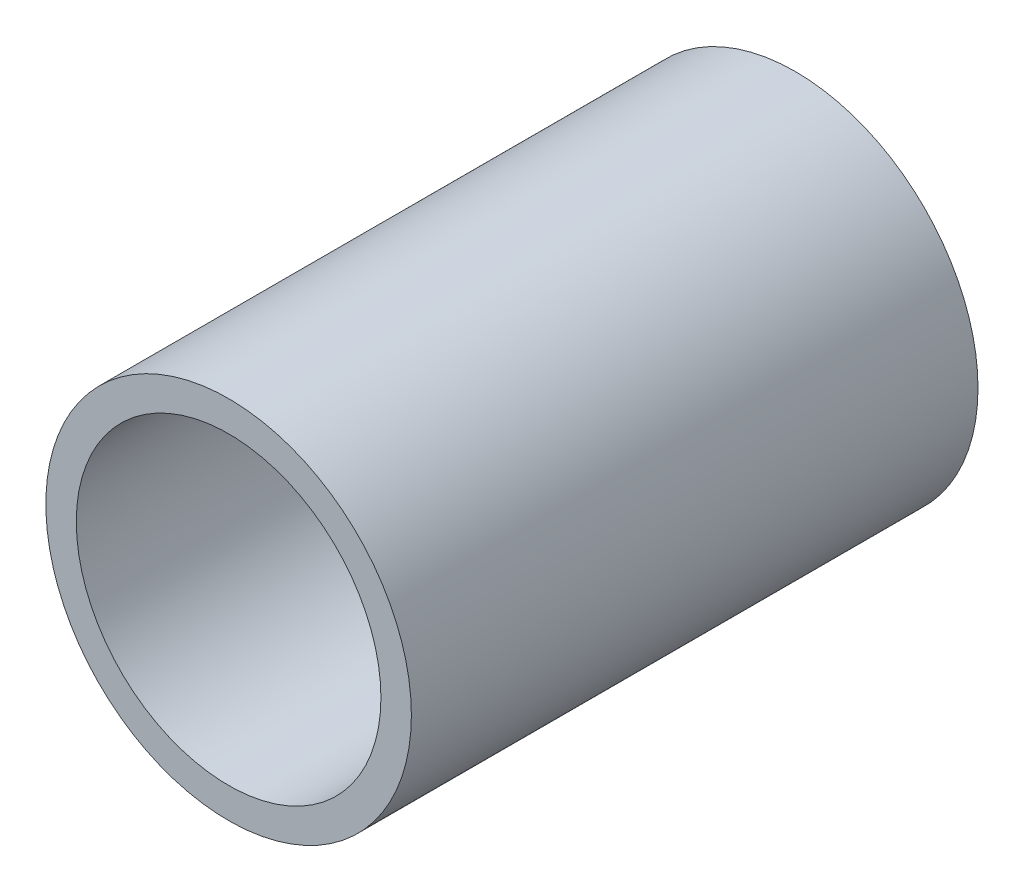
ISO-10303-21;
HEADER;
FILE_DESCRIPTION(('STEP AP214'),'2;1');
FILE_NAME('part.step','',(''),(''),'','','');
FILE_SCHEMA(('AUTOMOTIVE_DESIGN { 1 0 10303 214 1 1 1 1 }'));
ENDSEC;
DATA;
#1=APPLICATION_CONTEXT('core data for automotive mechanical design processes');
#2=APPLICATION_PROTOCOL_DEFINITION('international standard','automotive_design',2000,#1);
#3=PRODUCT_CONTEXT('',#1,'mechanical');
#4=PRODUCT('Part','Part','',(#3));
#5=PRODUCT_RELATED_PRODUCT_CATEGORY('part','',(#4));
#6=PRODUCT_DEFINITION_FORMATION('','',#4);
#7=PRODUCT_DEFINITION_CONTEXT('part definition',#1,'design');
#8=PRODUCT_DEFINITION('design','',#6,#7);
#9=PRODUCT_DEFINITION_SHAPE('','',#8);
#10=(LENGTH_UNIT() NAMED_UNIT(*) SI_UNIT(.MILLI.,.METRE.));
#11=(NAMED_UNIT(*) PLANE_ANGLE_UNIT() SI_UNIT($,.RADIAN.));
#12=(NAMED_UNIT(*) SI_UNIT($,.STERADIAN.) SOLID_ANGLE_UNIT());
#13=UNCERTAINTY_MEASURE_WITH_UNIT(LENGTH_MEASURE(1.E-05),#10,'distance_accuracy_value','');
#14=(GEOMETRIC_REPRESENTATION_CONTEXT(3) GLOBAL_UNCERTAINTY_ASSIGNED_CONTEXT((#13)) GLOBAL_UNIT_ASSIGNED_CONTEXT((#10,
#11,#12)) REPRESENTATION_CONTEXT('',''));
#15=CARTESIAN_POINT('',(0.,0.,0.));
#16=DIRECTION('',(0.,0.,1.));
#17=DIRECTION('',(1.,0.,0.));
#18=AXIS2_PLACEMENT_3D('',#15,#16,#17);
#19=CARTESIAN_POINT('',(0.,0.,-35.571762748477));
#20=DIRECTION('',(0.,0.,1.));
#21=DIRECTION('',(1.,0.,0.));
#22=AXIS2_PLACEMENT_3D('',#19,#20,#21);
#23=CYLINDRICAL_SURFACE('',#22,6.);
#24=CARTESIAN_POINT('',(0.,0.,0.));
#25=DIRECTION('',(0.,0.,1.));
#26=DIRECTION('',(1.,0.,0.));
#27=AXIS2_PLACEMENT_3D('',#24,#25,#26);
#28=CIRCLE('',#27,6.);
#29=CARTESIAN_POINT('',(6.,0.,0.));
#30=VERTEX_POINT('',#29);
#31=EDGE_CURVE('E42',#30,#30,#28,.T.);
#32=ORIENTED_EDGE('',*,*,#31,.F.);
#33=EDGE_LOOP('',(#32));
#34=FACE_BOUND('',#33,.T.);
#35=CARTESIAN_POINT('',(0.,0.,-18.6011999999999));
#36=DIRECTION('',(0.,0.,-1.));
#37=DIRECTION('',(0.,1.,0.));
#38=AXIS2_PLACEMENT_3D('',#35,#36,#37);
#39=CIRCLE('',#38,6.);
#40=CARTESIAN_POINT('',(0.,6.,-18.6011999999999));
#41=VERTEX_POINT('',#40);
#42=EDGE_CURVE('E51',#41,#41,#39,.F.);
#43=ORIENTED_EDGE('',*,*,#42,.T.);
#44=EDGE_LOOP('',(#43));
#45=FACE_BOUND('',#44,.T.);
#46=ADVANCED_FACE('F35',(#34,#45),#23,.T.);
#47=CARTESIAN_POINT('',(0.,0.,-35.571762748477));
#48=DIRECTION('',(0.,0.,1.));
#49=DIRECTION('',(1.,0.,0.));
#50=AXIS2_PLACEMENT_3D('',#47,#48,#49);
#51=CYLINDRICAL_SURFACE('',#50,5.);
#52=CARTESIAN_POINT('',(0.,0.,0.));
#53=DIRECTION('',(0.,0.,1.));
#54=DIRECTION('',(1.,0.,0.));
#55=AXIS2_PLACEMENT_3D('',#52,#53,#54);
#56=CIRCLE('',#55,5.);
#57=CARTESIAN_POINT('',(5.,0.,0.));
#58=VERTEX_POINT('',#57);
#59=EDGE_CURVE('E46',#58,#58,#56,.T.);
#60=ORIENTED_EDGE('',*,*,#59,.T.);
#61=EDGE_LOOP('',(#60));
#62=FACE_BOUND('',#61,.T.);
#63=CARTESIAN_POINT('',(0.,0.,-18.6011999999999));
#64=DIRECTION('',(0.,0.,-1.));
#65=DIRECTION('',(0.,1.,0.));
#66=AXIS2_PLACEMENT_3D('',#63,#64,#65);
#67=CIRCLE('',#66,5.);
#68=CARTESIAN_POINT('',(0.,5.,-18.6011999999999));
#69=VERTEX_POINT('',#68);
#70=EDGE_CURVE('E10',#69,#69,#67,.F.);
#71=ORIENTED_EDGE('',*,*,#70,.F.);
#72=EDGE_LOOP('',(#71));
#73=FACE_BOUND('',#72,.T.);
#74=ADVANCED_FACE('F62',(#62,#73),#51,.F.);
#75=CARTESIAN_POINT('',(0.,0.,0.));
#76=DIRECTION('',(0.,0.,1.));
#77=DIRECTION('',(1.,0.,0.));
#78=AXIS2_PLACEMENT_3D('',#75,#76,#77);
#79=PLANE('',#78);
#80=ORIENTED_EDGE('',*,*,#59,.F.);
#81=EDGE_LOOP('',(#80));
#82=FACE_BOUND('',#81,.T.);
#83=ORIENTED_EDGE('',*,*,#31,.T.);
#84=EDGE_LOOP('',(#83));
#85=FACE_BOUND('',#84,.T.);
#86=ADVANCED_FACE('F58',(#82,#85),#79,.T.);
#87=CARTESIAN_POINT('',(-29.5995774624953,69.9740309975186,-18.6012000000001));
#88=DIRECTION('',(0.,0.,-1.));
#89=DIRECTION('',(-0.490177109033745,0.871622855241486,0.));
#90=AXIS2_PLACEMENT_3D('',#87,#88,#89);
#91=PLANE('',#90);
#92=ORIENTED_EDGE('',*,*,#42,.F.);
#93=EDGE_LOOP('',(#92));
#94=FACE_BOUND('',#93,.T.);
#95=ORIENTED_EDGE('',*,*,#70,.T.);
#96=EDGE_LOOP('',(#95));
#97=FACE_BOUND('',#96,.T.);
#98=ADVANCED_FACE('F37',(#94,#97),#91,.T.);
#99=CLOSED_SHELL('',(#46,#74,#86,#98));
#100=MANIFOLD_SOLID_BREP('B2',#99);
#101=ADVANCED_BREP_SHAPE_REPRESENTATION('',(#18,#100),#14);
#102=SHAPE_DEFINITION_REPRESENTATION(#9,#101);
ENDSEC;
END-ISO-10303-21;
